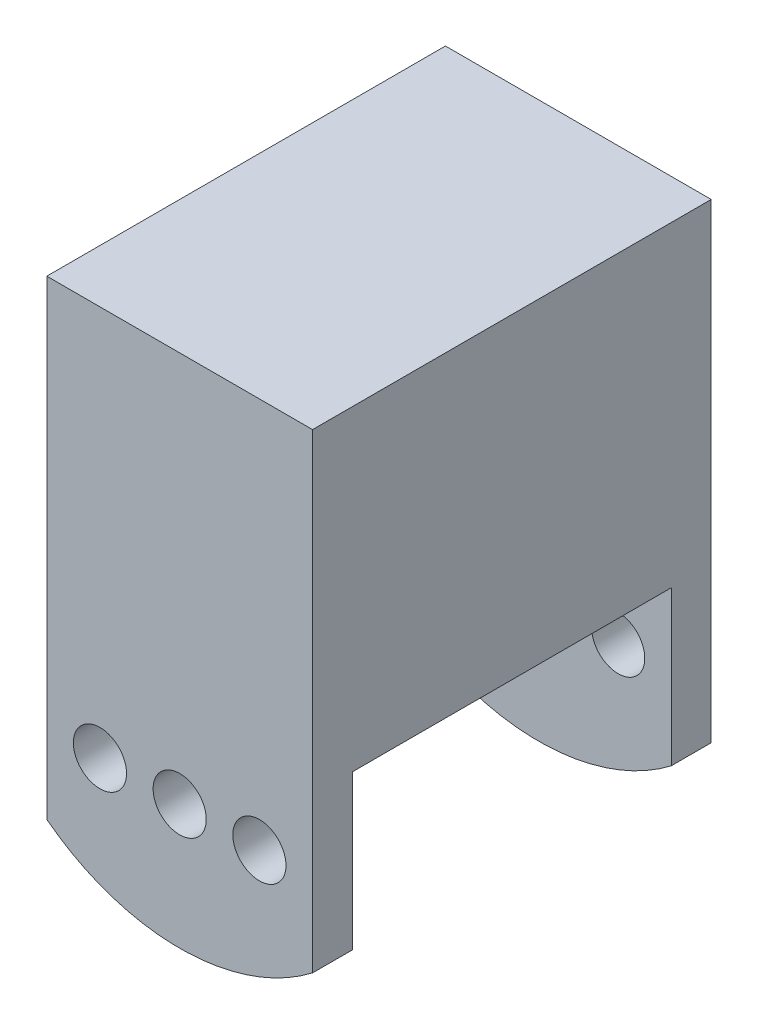
ISO-10303-21;
HEADER;
FILE_DESCRIPTION(('STEP AP214'),'2;1');
FILE_NAME('part.step','',(''),(''),'','','');
FILE_SCHEMA(('AUTOMOTIVE_DESIGN { 1 0 10303 214 1 1 1 1 }'));
ENDSEC;
DATA;
#1=APPLICATION_CONTEXT('core data for automotive mechanical design processes');
#2=APPLICATION_PROTOCOL_DEFINITION('international standard','automotive_design',2000,#1);
#3=PRODUCT_CONTEXT('',#1,'mechanical');
#4=PRODUCT('Part','Part','',(#3));
#5=PRODUCT_RELATED_PRODUCT_CATEGORY('part','',(#4));
#6=PRODUCT_DEFINITION_FORMATION('','',#4);
#7=PRODUCT_DEFINITION_CONTEXT('part definition',#1,'design');
#8=PRODUCT_DEFINITION('design','',#6,#7);
#9=PRODUCT_DEFINITION_SHAPE('','',#8);
#10=(LENGTH_UNIT() NAMED_UNIT(*) SI_UNIT(.MILLI.,.METRE.));
#11=(NAMED_UNIT(*) PLANE_ANGLE_UNIT() SI_UNIT($,.RADIAN.));
#12=(NAMED_UNIT(*) SI_UNIT($,.STERADIAN.) SOLID_ANGLE_UNIT());
#13=UNCERTAINTY_MEASURE_WITH_UNIT(LENGTH_MEASURE(1.E-05),#10,'distance_accuracy_value','');
#14=(GEOMETRIC_REPRESENTATION_CONTEXT(3) GLOBAL_UNCERTAINTY_ASSIGNED_CONTEXT((#13)) GLOBAL_UNIT_ASSIGNED_CONTEXT((#10,
#11,#12)) REPRESENTATION_CONTEXT('',''));
#15=CARTESIAN_POINT('',(0.,0.,0.));
#16=DIRECTION('',(0.,0.,1.));
#17=DIRECTION('',(1.,0.,0.));
#18=AXIS2_PLACEMENT_3D('',#15,#16,#17);
#19=CARTESIAN_POINT('',(0.,0.,30.));
#20=DIRECTION('',(0.,0.,-1.));
#21=DIRECTION('',(-1.,0.,0.));
#22=AXIS2_PLACEMENT_3D('',#19,#20,#21);
#23=CYLINDRICAL_SURFACE('',#22,16.4267963170458);
#24=DIRECTION('',(0.,0.,-1.));
#25=VECTOR('',#24,1.);
#26=CARTESIAN_POINT('',(10.,-13.032253728412,30.));
#27=LINE('',#26,#25);
#28=CARTESIAN_POINT('',(10.,-13.032253728412,3.));
#29=VERTEX_POINT('',#28);
#30=CARTESIAN_POINT('',(10.,-13.032253728412,0.));
#31=VERTEX_POINT('',#30);
#32=EDGE_CURVE('E83',#29,#31,#27,.T.);
#33=ORIENTED_EDGE('',*,*,#32,.F.);
#34=CARTESIAN_POINT('',(0.,0.,3.));
#35=DIRECTION('',(0.,0.,-1.));
#36=DIRECTION('',(-1.,0.,0.));
#37=AXIS2_PLACEMENT_3D('',#34,#35,#36);
#38=CIRCLE('',#37,16.4267963170458);
#39=CARTESIAN_POINT('',(-10.,-13.032253728412,3.));
#40=VERTEX_POINT('',#39);
#41=EDGE_CURVE('E54',#29,#40,#38,.T.);
#42=ORIENTED_EDGE('',*,*,#41,.T.);
#43=DIRECTION('',(0.,0.,-1.));
#44=VECTOR('',#43,1.);
#45=CARTESIAN_POINT('',(-10.,-13.032253728412,30.));
#46=LINE('',#45,#44);
#47=CARTESIAN_POINT('',(-10.,-13.032253728412,0.));
#48=VERTEX_POINT('',#47);
#49=EDGE_CURVE('E133',#40,#48,#46,.T.);
#50=ORIENTED_EDGE('',*,*,#49,.T.);
#51=CARTESIAN_POINT('',(0.,0.,0.));
#52=DIRECTION('',(0.,0.,1.));
#53=DIRECTION('',(1.,0.,0.));
#54=AXIS2_PLACEMENT_3D('',#51,#52,#53);
#55=CIRCLE('',#54,16.4267963170458);
#56=EDGE_CURVE('E184',#48,#31,#55,.T.);
#57=ORIENTED_EDGE('',*,*,#56,.T.);
#58=EDGE_LOOP('',(#33,#42,#50,#57));
#59=FACE_BOUND('',#58,.T.);
#60=ADVANCED_FACE('F37',(#59),#23,.T.);
#61=CARTESIAN_POINT('',(0.,-7.03225372841202,30.));
#62=DIRECTION('',(0.,0.,-1.));
#63=DIRECTION('',(-1.,0.,0.));
#64=AXIS2_PLACEMENT_3D('',#61,#62,#63);
#65=CYLINDRICAL_SURFACE('',#64,2.);
#66=CARTESIAN_POINT('',(0.,-7.03225372841202,27.));
#67=DIRECTION('',(0.,0.,1.));
#68=DIRECTION('',(1.,0.,0.));
#69=AXIS2_PLACEMENT_3D('',#66,#67,#68);
#70=CIRCLE('',#69,2.);
#71=CARTESIAN_POINT('',(2.,-7.03225372841202,27.));
#72=VERTEX_POINT('',#71);
#73=EDGE_CURVE('E158',#72,#72,#70,.T.);
#74=ORIENTED_EDGE('',*,*,#73,.F.);
#75=EDGE_LOOP('',(#74));
#76=FACE_BOUND('',#75,.T.);
#77=CARTESIAN_POINT('',(0.,-7.03225372841202,30.));
#78=DIRECTION('',(0.,0.,1.));
#79=DIRECTION('',(1.,0.,0.));
#80=AXIS2_PLACEMENT_3D('',#77,#78,#79);
#81=CIRCLE('',#80,2.);
#82=CARTESIAN_POINT('',(2.,-7.03225372841202,30.));
#83=VERTEX_POINT('',#82);
#84=EDGE_CURVE('E176',#83,#83,#81,.T.);
#85=ORIENTED_EDGE('',*,*,#84,.T.);
#86=EDGE_LOOP('',(#85));
#87=FACE_BOUND('',#86,.T.);
#88=ADVANCED_FACE('F231',(#76,#87),#65,.F.);
#89=CARTESIAN_POINT('',(6.,-7.03225372841202,30.));
#90=DIRECTION('',(0.,0.,-1.));
#91=DIRECTION('',(-1.,0.,0.));
#92=AXIS2_PLACEMENT_3D('',#89,#90,#91);
#93=CYLINDRICAL_SURFACE('',#92,2.);
#94=CARTESIAN_POINT('',(6.,-7.03225372841202,27.));
#95=DIRECTION('',(0.,0.,1.));
#96=DIRECTION('',(1.,0.,0.));
#97=AXIS2_PLACEMENT_3D('',#94,#95,#96);
#98=CIRCLE('',#97,2.);
#99=CARTESIAN_POINT('',(8.,-7.03225372841202,27.));
#100=VERTEX_POINT('',#99);
#101=EDGE_CURVE('E155',#100,#100,#98,.T.);
#102=ORIENTED_EDGE('',*,*,#101,.F.);
#103=EDGE_LOOP('',(#102));
#104=FACE_BOUND('',#103,.T.);
#105=CARTESIAN_POINT('',(6.,-7.03225372841202,30.));
#106=DIRECTION('',(0.,0.,1.));
#107=DIRECTION('',(1.,0.,0.));
#108=AXIS2_PLACEMENT_3D('',#105,#106,#107);
#109=CIRCLE('',#108,2.);
#110=CARTESIAN_POINT('',(8.,-7.03225372841202,30.));
#111=VERTEX_POINT('',#110);
#112=EDGE_CURVE('E170',#111,#111,#109,.T.);
#113=ORIENTED_EDGE('',*,*,#112,.T.);
#114=EDGE_LOOP('',(#113));
#115=FACE_BOUND('',#114,.T.);
#116=ADVANCED_FACE('F236',(#104,#115),#93,.F.);
#117=CARTESIAN_POINT('',(-6.,-7.03225372841202,30.));
#118=DIRECTION('',(0.,0.,-1.));
#119=DIRECTION('',(-1.,0.,0.));
#120=AXIS2_PLACEMENT_3D('',#117,#118,#119);
#121=CYLINDRICAL_SURFACE('',#120,2.);
#122=CARTESIAN_POINT('',(-6.,-7.03225372841202,27.));
#123=DIRECTION('',(0.,0.,1.));
#124=DIRECTION('',(1.,0.,0.));
#125=AXIS2_PLACEMENT_3D('',#122,#123,#124);
#126=CIRCLE('',#125,2.);
#127=CARTESIAN_POINT('',(-4.,-7.03225372841202,27.));
#128=VERTEX_POINT('',#127);
#129=EDGE_CURVE('E41',#128,#128,#126,.T.);
#130=ORIENTED_EDGE('',*,*,#129,.F.);
#131=EDGE_LOOP('',(#130));
#132=FACE_BOUND('',#131,.T.);
#133=CARTESIAN_POINT('',(-6.,-7.03225372841202,30.));
#134=DIRECTION('',(0.,0.,1.));
#135=DIRECTION('',(1.,0.,0.));
#136=AXIS2_PLACEMENT_3D('',#133,#134,#135);
#137=CIRCLE('',#136,2.);
#138=CARTESIAN_POINT('',(-4.,-7.03225372841202,30.));
#139=VERTEX_POINT('',#138);
#140=EDGE_CURVE('E164',#139,#139,#137,.T.);
#141=ORIENTED_EDGE('',*,*,#140,.T.);
#142=EDGE_LOOP('',(#141));
#143=FACE_BOUND('',#142,.T.);
#144=ADVANCED_FACE('F212',(#132,#143),#121,.F.);
#145=CARTESIAN_POINT('',(0.,0.,30.));
#146=DIRECTION('',(0.,0.,1.));
#147=DIRECTION('',(1.,0.,0.));
#148=AXIS2_PLACEMENT_3D('',#145,#146,#147);
#149=PLANE('',#148);
#150=ORIENTED_EDGE('',*,*,#112,.F.);
#151=EDGE_LOOP('',(#150));
#152=FACE_BOUND('',#151,.T.);
#153=DIRECTION('',(0.,1.,0.));
#154=VECTOR('',#153,1.);
#155=CARTESIAN_POINT('',(10.,22.377746271588,30.));
#156=LINE('',#155,#154);
#157=CARTESIAN_POINT('',(10.,-13.032253728412,30.));
#158=VERTEX_POINT('',#157);
#159=CARTESIAN_POINT('',(10.,22.377746271588,30.));
#160=VERTEX_POINT('',#159);
#161=EDGE_CURVE('E182',#158,#160,#156,.T.);
#162=ORIENTED_EDGE('',*,*,#161,.T.);
#163=DIRECTION('',(-1.,0.,0.));
#164=VECTOR('',#163,1.);
#165=CARTESIAN_POINT('',(-10.,22.377746271588,30.));
#166=LINE('',#165,#164);
#167=CARTESIAN_POINT('',(-10.,22.377746271588,30.));
#168=VERTEX_POINT('',#167);
#169=EDGE_CURVE('E90',#160,#168,#166,.T.);
#170=ORIENTED_EDGE('',*,*,#169,.T.);
#171=DIRECTION('',(0.,-1.,0.));
#172=VECTOR('',#171,1.);
#173=CARTESIAN_POINT('',(-10.,-13.032253728412,30.));
#174=LINE('',#173,#172);
#175=CARTESIAN_POINT('',(-10.,-13.032253728412,30.));
#176=VERTEX_POINT('',#175);
#177=EDGE_CURVE('E186',#168,#176,#174,.T.);
#178=ORIENTED_EDGE('',*,*,#177,.T.);
#179=CARTESIAN_POINT('',(0.,0.,30.));
#180=DIRECTION('',(0.,0.,1.));
#181=DIRECTION('',(1.,0.,0.));
#182=AXIS2_PLACEMENT_3D('',#179,#180,#181);
#183=CIRCLE('',#182,16.4267963170458);
#184=EDGE_CURVE('E63',#176,#158,#183,.T.);
#185=ORIENTED_EDGE('',*,*,#184,.T.);
#186=EDGE_LOOP('',(#162,#170,#178,#185));
#187=FACE_BOUND('',#186,.T.);
#188=ORIENTED_EDGE('',*,*,#84,.F.);
#189=EDGE_LOOP('',(#188));
#190=FACE_BOUND('',#189,.T.);
#191=ORIENTED_EDGE('',*,*,#140,.F.);
#192=EDGE_LOOP('',(#191));
#193=FACE_BOUND('',#192,.T.);
#194=ADVANCED_FACE('F217',(#152,#187,#190,#193),#149,.T.);
#195=CARTESIAN_POINT('',(0.,0.,0.));
#196=DIRECTION('',(0.,0.,1.));
#197=DIRECTION('',(1.,0.,0.));
#198=AXIS2_PLACEMENT_3D('',#195,#196,#197);
#199=PLANE('',#198);
#200=DIRECTION('',(0.,1.,0.));
#201=VECTOR('',#200,1.);
#202=CARTESIAN_POINT('',(10.,22.377746271588,0.));
#203=LINE('',#202,#201);
#204=CARTESIAN_POINT('',(10.,22.377746271588,0.));
#205=VERTEX_POINT('',#204);
#206=EDGE_CURVE('E179',#31,#205,#203,.T.);
#207=ORIENTED_EDGE('',*,*,#206,.F.);
#208=ORIENTED_EDGE('',*,*,#56,.F.);
#209=DIRECTION('',(0.,-1.,0.));
#210=VECTOR('',#209,1.);
#211=CARTESIAN_POINT('',(-10.,-13.032253728412,0.));
#212=LINE('',#211,#210);
#213=CARTESIAN_POINT('',(-10.,22.377746271588,0.));
#214=VERTEX_POINT('',#213);
#215=EDGE_CURVE('E192',#214,#48,#212,.T.);
#216=ORIENTED_EDGE('',*,*,#215,.F.);
#217=DIRECTION('',(-1.,0.,0.));
#218=VECTOR('',#217,1.);
#219=CARTESIAN_POINT('',(-10.,22.377746271588,0.));
#220=LINE('',#219,#218);
#221=EDGE_CURVE('E190',#205,#214,#220,.T.);
#222=ORIENTED_EDGE('',*,*,#221,.F.);
#223=EDGE_LOOP('',(#207,#208,#216,#222));
#224=FACE_BOUND('',#223,.T.);
#225=CARTESIAN_POINT('',(0.,-7.03225372841202,0.));
#226=DIRECTION('',(0.,0.,1.));
#227=DIRECTION('',(1.,0.,0.));
#228=AXIS2_PLACEMENT_3D('',#225,#226,#227);
#229=CIRCLE('',#228,2.);
#230=CARTESIAN_POINT('',(2.,-7.03225372841202,0.));
#231=VERTEX_POINT('',#230);
#232=EDGE_CURVE('E173',#231,#231,#229,.T.);
#233=ORIENTED_EDGE('',*,*,#232,.T.);
#234=EDGE_LOOP('',(#233));
#235=FACE_BOUND('',#234,.T.);
#236=CARTESIAN_POINT('',(6.,-7.03225372841202,0.));
#237=DIRECTION('',(0.,0.,1.));
#238=DIRECTION('',(1.,0.,0.));
#239=AXIS2_PLACEMENT_3D('',#236,#237,#238);
#240=CIRCLE('',#239,2.);
#241=CARTESIAN_POINT('',(8.,-7.03225372841202,0.));
#242=VERTEX_POINT('',#241);
#243=EDGE_CURVE('E167',#242,#242,#240,.T.);
#244=ORIENTED_EDGE('',*,*,#243,.T.);
#245=EDGE_LOOP('',(#244));
#246=FACE_BOUND('',#245,.T.);
#247=CARTESIAN_POINT('',(-6.,-7.03225372841202,0.));
#248=DIRECTION('',(0.,0.,1.));
#249=DIRECTION('',(1.,0.,0.));
#250=AXIS2_PLACEMENT_3D('',#247,#248,#249);
#251=CIRCLE('',#250,2.);
#252=CARTESIAN_POINT('',(-4.,-7.03225372841202,0.));
#253=VERTEX_POINT('',#252);
#254=EDGE_CURVE('E163',#253,#253,#251,.T.);
#255=ORIENTED_EDGE('',*,*,#254,.T.);
#256=EDGE_LOOP('',(#255));
#257=FACE_BOUND('',#256,.T.);
#258=ADVANCED_FACE('F215',(#224,#235,#246,#257),#199,.F.);
#259=CARTESIAN_POINT('',(10.,22.377746271588,30.));
#260=DIRECTION('',(-1.,0.,0.));
#261=DIRECTION('',(0.,0.,1.));
#262=AXIS2_PLACEMENT_3D('',#259,#260,#261);
#263=PLANE('',#262);
#264=CARTESIAN_POINT('',(10.,-13.032253728412,27.));
#265=VERTEX_POINT('',#264);
#266=EDGE_CURVE('E195',#158,#265,#27,.T.);
#267=ORIENTED_EDGE('',*,*,#266,.T.);
#268=DIRECTION('',(0.,-1.,0.));
#269=VECTOR('',#268,1.);
#270=CARTESIAN_POINT('',(10.,-16.4267963170458,27.));
#271=LINE('',#270,#269);
#272=CARTESIAN_POINT('',(10.,-1.42679631704578,27.));
#273=VERTEX_POINT('',#272);
#274=EDGE_CURVE('E140',#273,#265,#271,.T.);
#275=ORIENTED_EDGE('',*,*,#274,.F.);
#276=DIRECTION('',(0.,0.,1.));
#277=VECTOR('',#276,1.);
#278=CARTESIAN_POINT('',(10.,-1.42679631704578,27.));
#279=LINE('',#278,#277);
#280=CARTESIAN_POINT('',(10.,-1.42679631704578,3.));
#281=VERTEX_POINT('',#280);
#282=EDGE_CURVE('E136',#281,#273,#279,.T.);
#283=ORIENTED_EDGE('',*,*,#282,.F.);
#284=DIRECTION('',(0.,1.,0.));
#285=VECTOR('',#284,1.);
#286=CARTESIAN_POINT('',(10.,-16.4267963170458,3.));
#287=LINE('',#286,#285);
#288=EDGE_CURVE('E118',#29,#281,#287,.T.);
#289=ORIENTED_EDGE('',*,*,#288,.F.);
#290=ORIENTED_EDGE('',*,*,#32,.T.);
#291=ORIENTED_EDGE('',*,*,#206,.T.);
#292=DIRECTION('',(0.,0.,-1.));
#293=VECTOR('',#292,1.);
#294=CARTESIAN_POINT('',(10.,22.377746271588,30.));
#295=LINE('',#294,#293);
#296=EDGE_CURVE('E11',#160,#205,#295,.T.);
#297=ORIENTED_EDGE('',*,*,#296,.F.);
#298=ORIENTED_EDGE('',*,*,#161,.F.);
#299=EDGE_LOOP('',(#267,#275,#283,#289,#290,#291,#297,#298));
#300=FACE_BOUND('',#299,.T.);
#301=ADVANCED_FACE('F39',(#300),#263,.F.);
#302=CARTESIAN_POINT('',(-10.,22.377746271588,30.));
#303=DIRECTION('',(0.,-1.,0.));
#304=DIRECTION('',(0.,0.,-1.));
#305=AXIS2_PLACEMENT_3D('',#302,#303,#304);
#306=PLANE('',#305);
#307=ORIENTED_EDGE('',*,*,#221,.T.);
#308=DIRECTION('',(0.,0.,-1.));
#309=VECTOR('',#308,1.);
#310=CARTESIAN_POINT('',(-10.,22.377746271588,30.));
#311=LINE('',#310,#309);
#312=EDGE_CURVE('E46',#168,#214,#311,.T.);
#313=ORIENTED_EDGE('',*,*,#312,.F.);
#314=ORIENTED_EDGE('',*,*,#169,.F.);
#315=ORIENTED_EDGE('',*,*,#296,.T.);
#316=EDGE_LOOP('',(#307,#313,#314,#315));
#317=FACE_BOUND('',#316,.T.);
#318=ADVANCED_FACE('F224',(#317),#306,.F.);
#319=CARTESIAN_POINT('',(-10.,-13.032253728412,30.));
#320=DIRECTION('',(1.,0.,0.));
#321=DIRECTION('',(0.,0.,-1.));
#322=AXIS2_PLACEMENT_3D('',#319,#320,#321);
#323=PLANE('',#322);
#324=CARTESIAN_POINT('',(-10.,10.4732036829542,15.));
#325=DIRECTION('',(-1.,0.,0.));
#326=DIRECTION('',(0.,0.,1.));
#327=AXIS2_PLACEMENT_3D('',#324,#325,#326);
#328=CIRCLE('',#327,8.90000000000001);
#329=CARTESIAN_POINT('',(-10.,10.4732036829542,23.9));
#330=VERTEX_POINT('',#329);
#331=EDGE_CURVE('E552',#330,#330,#328,.T.);
#332=ORIENTED_EDGE('',*,*,#331,.F.);
#333=EDGE_LOOP('',(#332));
#334=FACE_BOUND('',#333,.T.);
#335=DIRECTION('',(0.,0.,1.));
#336=VECTOR('',#335,1.);
#337=CARTESIAN_POINT('',(-10.,-1.42679631704578,27.));
#338=LINE('',#337,#336);
#339=CARTESIAN_POINT('',(-10.,-1.42679631704578,3.));
#340=VERTEX_POINT('',#339);
#341=CARTESIAN_POINT('',(-10.,-1.42679631704578,27.));
#342=VERTEX_POINT('',#341);
#343=EDGE_CURVE('E123',#340,#342,#338,.T.);
#344=ORIENTED_EDGE('',*,*,#343,.T.);
#345=DIRECTION('',(0.,-1.,0.));
#346=VECTOR('',#345,1.);
#347=CARTESIAN_POINT('',(-10.,-16.4267963170458,27.));
#348=LINE('',#347,#346);
#349=CARTESIAN_POINT('',(-10.,-13.032253728412,27.));
#350=VERTEX_POINT('',#349);
#351=EDGE_CURVE('E134',#342,#350,#348,.T.);
#352=ORIENTED_EDGE('',*,*,#351,.T.);
#353=EDGE_CURVE('E198',#176,#350,#46,.T.);
#354=ORIENTED_EDGE('',*,*,#353,.F.);
#355=ORIENTED_EDGE('',*,*,#177,.F.);
#356=ORIENTED_EDGE('',*,*,#312,.T.);
#357=ORIENTED_EDGE('',*,*,#215,.T.);
#358=ORIENTED_EDGE('',*,*,#49,.F.);
#359=DIRECTION('',(0.,1.,0.));
#360=VECTOR('',#359,1.);
#361=CARTESIAN_POINT('',(-10.,-16.4267963170458,3.));
#362=LINE('',#361,#360);
#363=EDGE_CURVE('E116',#40,#340,#362,.T.);
#364=ORIENTED_EDGE('',*,*,#363,.T.);
#365=EDGE_LOOP('',(#344,#352,#354,#355,#356,#357,#358,#364));
#366=FACE_BOUND('',#365,.T.);
#367=ADVANCED_FACE('F131',(#334,#366),#323,.F.);
#368=ORIENTED_EDGE('',*,*,#353,.T.);
#369=CARTESIAN_POINT('',(0.,0.,27.));
#370=DIRECTION('',(0.,0.,1.));
#371=DIRECTION('',(1.,0.,0.));
#372=AXIS2_PLACEMENT_3D('',#369,#370,#371);
#373=CIRCLE('',#372,16.4267963170458);
#374=EDGE_CURVE('E161',#350,#265,#373,.T.);
#375=ORIENTED_EDGE('',*,*,#374,.T.);
#376=ORIENTED_EDGE('',*,*,#266,.F.);
#377=ORIENTED_EDGE('',*,*,#184,.F.);
#378=EDGE_LOOP('',(#368,#375,#376,#377));
#379=FACE_BOUND('',#378,.T.);
#380=ADVANCED_FACE('F232',(#379),#23,.T.);
#381=CARTESIAN_POINT('',(0.,-7.03225372841202,3.));
#382=DIRECTION('',(0.,0.,-1.));
#383=DIRECTION('',(-1.,0.,0.));
#384=AXIS2_PLACEMENT_3D('',#381,#382,#383);
#385=CIRCLE('',#384,2.);
#386=CARTESIAN_POINT('',(-2.,-7.03225372841202,3.));
#387=VERTEX_POINT('',#386);
#388=EDGE_CURVE('E151',#387,#387,#385,.T.);
#389=ORIENTED_EDGE('',*,*,#388,.F.);
#390=EDGE_LOOP('',(#389));
#391=FACE_BOUND('',#390,.T.);
#392=ORIENTED_EDGE('',*,*,#232,.F.);
#393=EDGE_LOOP('',(#392));
#394=FACE_BOUND('',#393,.T.);
#395=ADVANCED_FACE('F239',(#391,#394),#65,.F.);
#396=CARTESIAN_POINT('',(6.,-7.03225372841202,3.));
#397=DIRECTION('',(0.,0.,-1.));
#398=DIRECTION('',(-1.,0.,0.));
#399=AXIS2_PLACEMENT_3D('',#396,#397,#398);
#400=CIRCLE('',#399,2.);
#401=CARTESIAN_POINT('',(4.,-7.03225372841202,3.));
#402=VERTEX_POINT('',#401);
#403=EDGE_CURVE('E148',#402,#402,#400,.T.);
#404=ORIENTED_EDGE('',*,*,#403,.F.);
#405=EDGE_LOOP('',(#404));
#406=FACE_BOUND('',#405,.T.);
#407=ORIENTED_EDGE('',*,*,#243,.F.);
#408=EDGE_LOOP('',(#407));
#409=FACE_BOUND('',#408,.T.);
#410=ADVANCED_FACE('F210',(#406,#409),#93,.F.);
#411=CARTESIAN_POINT('',(-6.,-7.03225372841202,3.));
#412=DIRECTION('',(0.,0.,-1.));
#413=DIRECTION('',(-1.,0.,0.));
#414=AXIS2_PLACEMENT_3D('',#411,#412,#413);
#415=CIRCLE('',#414,2.);
#416=CARTESIAN_POINT('',(-8.,-7.03225372841202,3.));
#417=VERTEX_POINT('',#416);
#418=EDGE_CURVE('E146',#417,#417,#415,.T.);
#419=ORIENTED_EDGE('',*,*,#418,.F.);
#420=EDGE_LOOP('',(#419));
#421=FACE_BOUND('',#420,.T.);
#422=ORIENTED_EDGE('',*,*,#254,.F.);
#423=EDGE_LOOP('',(#422));
#424=FACE_BOUND('',#423,.T.);
#425=ADVANCED_FACE('F206',(#421,#424),#121,.F.);
#426=CARTESIAN_POINT('',(-10.,-16.4267963170458,27.));
#427=DIRECTION('',(0.,0.,1.));
#428=DIRECTION('',(1.,0.,0.));
#429=AXIS2_PLACEMENT_3D('',#426,#427,#428);
#430=PLANE('',#429);
#431=ORIENTED_EDGE('',*,*,#73,.T.);
#432=EDGE_LOOP('',(#431));
#433=FACE_BOUND('',#432,.T.);
#434=ORIENTED_EDGE('',*,*,#101,.T.);
#435=EDGE_LOOP('',(#434));
#436=FACE_BOUND('',#435,.T.);
#437=ORIENTED_EDGE('',*,*,#129,.T.);
#438=EDGE_LOOP('',(#437));
#439=FACE_BOUND('',#438,.T.);
#440=ORIENTED_EDGE('',*,*,#351,.F.);
#441=DIRECTION('',(1.,0.,0.));
#442=VECTOR('',#441,1.);
#443=CARTESIAN_POINT('',(-10.,-1.42679631704578,27.));
#444=LINE('',#443,#442);
#445=EDGE_CURVE('E122',#342,#273,#444,.T.);
#446=ORIENTED_EDGE('',*,*,#445,.T.);
#447=ORIENTED_EDGE('',*,*,#274,.T.);
#448=ORIENTED_EDGE('',*,*,#374,.F.);
#449=EDGE_LOOP('',(#440,#446,#447,#448));
#450=FACE_BOUND('',#449,.T.);
#451=ADVANCED_FACE('F209',(#433,#436,#439,#450),#430,.F.);
#452=CARTESIAN_POINT('',(-10.,-16.4267963170458,3.));
#453=DIRECTION('',(0.,0.,-1.));
#454=DIRECTION('',(-1.,0.,0.));
#455=AXIS2_PLACEMENT_3D('',#452,#453,#454);
#456=PLANE('',#455);
#457=ORIENTED_EDGE('',*,*,#388,.T.);
#458=EDGE_LOOP('',(#457));
#459=FACE_BOUND('',#458,.T.);
#460=ORIENTED_EDGE('',*,*,#403,.T.);
#461=EDGE_LOOP('',(#460));
#462=FACE_BOUND('',#461,.T.);
#463=ORIENTED_EDGE('',*,*,#418,.T.);
#464=EDGE_LOOP('',(#463));
#465=FACE_BOUND('',#464,.T.);
#466=ORIENTED_EDGE('',*,*,#288,.T.);
#467=DIRECTION('',(1.,0.,0.));
#468=VECTOR('',#467,1.);
#469=CARTESIAN_POINT('',(-10.,-1.42679631704578,3.));
#470=LINE('',#469,#468);
#471=EDGE_CURVE('E112',#340,#281,#470,.T.);
#472=ORIENTED_EDGE('',*,*,#471,.F.);
#473=ORIENTED_EDGE('',*,*,#363,.F.);
#474=ORIENTED_EDGE('',*,*,#41,.F.);
#475=EDGE_LOOP('',(#466,#472,#473,#474));
#476=FACE_BOUND('',#475,.T.);
#477=ADVANCED_FACE('F114',(#459,#462,#465,#476),#456,.F.);
#478=CARTESIAN_POINT('',(-10.,-1.42679631704578,27.));
#479=DIRECTION('',(0.,1.,0.));
#480=DIRECTION('',(0.,0.,1.));
#481=AXIS2_PLACEMENT_3D('',#478,#479,#480);
#482=PLANE('',#481);
#483=ORIENTED_EDGE('',*,*,#282,.T.);
#484=ORIENTED_EDGE('',*,*,#445,.F.);
#485=ORIENTED_EDGE('',*,*,#343,.F.);
#486=ORIENTED_EDGE('',*,*,#471,.T.);
#487=EDGE_LOOP('',(#483,#484,#485,#486));
#488=FACE_BOUND('',#487,.T.);
#489=ADVANCED_FACE('F126',(#488),#482,.F.);
#490=CARTESIAN_POINT('',(-7.,10.4732036829542,15.));
#491=DIRECTION('',(-1.,0.,0.));
#492=DIRECTION('',(0.,0.,1.));
#493=AXIS2_PLACEMENT_3D('',#490,#491,#492);
#494=CYLINDRICAL_SURFACE('',#493,8.90000000000001);
#495=CARTESIAN_POINT('',(-7.,10.4732036829542,15.));
#496=DIRECTION('',(-1.,0.,0.));
#497=DIRECTION('',(0.,0.,1.));
#498=AXIS2_PLACEMENT_3D('',#495,#496,#497);
#499=CIRCLE('',#498,8.90000000000001);
#500=CARTESIAN_POINT('',(-7.,10.4732036829542,23.9));
#501=VERTEX_POINT('',#500);
#502=EDGE_CURVE('E143',#501,#501,#499,.T.);
#503=ORIENTED_EDGE('',*,*,#502,.F.);
#504=EDGE_LOOP('',(#503));
#505=FACE_BOUND('',#504,.T.);
#506=ORIENTED_EDGE('',*,*,#331,.T.);
#507=EDGE_LOOP('',(#506));
#508=FACE_BOUND('',#507,.T.);
#509=ADVANCED_FACE('F281',(#505,#508),#494,.F.);
#510=CARTESIAN_POINT('',(-7.,10.4732036829542,15.));
#511=DIRECTION('',(-1.,0.,0.));
#512=DIRECTION('',(0.,0.,1.));
#513=AXIS2_PLACEMENT_3D('',#510,#511,#512);
#514=PLANE('',#513);
#515=CARTESIAN_POINT('',(-7.,10.4732036829542,21.));
#516=DIRECTION('',(-1.,0.,0.));
#517=DIRECTION('',(0.,0.,1.));
#518=AXIS2_PLACEMENT_3D('',#515,#516,#517);
#519=CIRCLE('',#518,2.);
#520=CARTESIAN_POINT('',(-7.,10.4732036829542,23.));
#521=VERTEX_POINT('',#520);
#522=EDGE_CURVE('E531',#521,#521,#519,.T.);
#523=ORIENTED_EDGE('',*,*,#522,.F.);
#524=EDGE_LOOP('',(#523));
#525=FACE_BOUND('',#524,.T.);
#526=CARTESIAN_POINT('',(-7.,10.4732036829542,9.));
#527=DIRECTION('',(-1.,0.,0.));
#528=DIRECTION('',(0.,0.,1.));
#529=AXIS2_PLACEMENT_3D('',#526,#527,#528);
#530=CIRCLE('',#529,2.);
#531=CARTESIAN_POINT('',(-7.,10.4732036829542,11.));
#532=VERTEX_POINT('',#531);
#533=EDGE_CURVE('E537',#532,#532,#530,.T.);
#534=ORIENTED_EDGE('',*,*,#533,.F.);
#535=EDGE_LOOP('',(#534));
#536=FACE_BOUND('',#535,.T.);
#537=CARTESIAN_POINT('',(-7.,4.47320368295422,15.));
#538=DIRECTION('',(-1.,0.,0.));
#539=DIRECTION('',(0.,0.,1.));
#540=AXIS2_PLACEMENT_3D('',#537,#538,#539);
#541=CIRCLE('',#540,2.);
#542=CARTESIAN_POINT('',(-7.,4.47320368295422,17.));
#543=VERTEX_POINT('',#542);
#544=EDGE_CURVE('E543',#543,#543,#541,.T.);
#545=ORIENTED_EDGE('',*,*,#544,.F.);
#546=EDGE_LOOP('',(#545));
#547=FACE_BOUND('',#546,.T.);
#548=CARTESIAN_POINT('',(-7.,16.4732036829542,15.));
#549=DIRECTION('',(-1.,0.,0.));
#550=DIRECTION('',(0.,0.,1.));
#551=AXIS2_PLACEMENT_3D('',#548,#549,#550);
#552=CIRCLE('',#551,2.);
#553=CARTESIAN_POINT('',(-7.,16.4732036829542,17.));
#554=VERTEX_POINT('',#553);
#555=EDGE_CURVE('E549',#554,#554,#552,.T.);
#556=ORIENTED_EDGE('',*,*,#555,.F.);
#557=EDGE_LOOP('',(#556));
#558=FACE_BOUND('',#557,.T.);
#559=ORIENTED_EDGE('',*,*,#502,.T.);
#560=EDGE_LOOP('',(#559));
#561=FACE_BOUND('',#560,.T.);
#562=ADVANCED_FACE('F286',(#525,#536,#547,#558,#561),#514,.T.);
#563=CARTESIAN_POINT('',(-7.,16.4732036829542,15.));
#564=DIRECTION('',(-1.,0.,0.));
#565=DIRECTION('',(0.,0.,1.));
#566=AXIS2_PLACEMENT_3D('',#563,#564,#565);
#567=CYLINDRICAL_SURFACE('',#566,2.);
#568=ORIENTED_EDGE('',*,*,#555,.T.);
#569=EDGE_LOOP('',(#568));
#570=FACE_BOUND('',#569,.T.);
#571=CARTESIAN_POINT('',(-10.,16.4732036829542,15.));
#572=DIRECTION('',(-1.,0.,0.));
#573=DIRECTION('',(0.,0.,1.));
#574=AXIS2_PLACEMENT_3D('',#571,#572,#573);
#575=CIRCLE('',#574,2.);
#576=CARTESIAN_POINT('',(-10.,16.4732036829542,17.));
#577=VERTEX_POINT('',#576);
#578=EDGE_CURVE('E546',#577,#577,#575,.T.);
#579=ORIENTED_EDGE('',*,*,#578,.F.);
#580=EDGE_LOOP('',(#579));
#581=FACE_BOUND('',#580,.T.);
#582=ADVANCED_FACE('F298',(#570,#581),#567,.T.);
#583=CARTESIAN_POINT('',(-7.,4.47320368295422,15.));
#584=DIRECTION('',(-1.,0.,0.));
#585=DIRECTION('',(0.,0.,1.));
#586=AXIS2_PLACEMENT_3D('',#583,#584,#585);
#587=CYLINDRICAL_SURFACE('',#586,2.);
#588=ORIENTED_EDGE('',*,*,#544,.T.);
#589=EDGE_LOOP('',(#588));
#590=FACE_BOUND('',#589,.T.);
#591=CARTESIAN_POINT('',(-10.,4.47320368295422,15.));
#592=DIRECTION('',(-1.,0.,0.));
#593=DIRECTION('',(0.,0.,1.));
#594=AXIS2_PLACEMENT_3D('',#591,#592,#593);
#595=CIRCLE('',#594,2.);
#596=CARTESIAN_POINT('',(-10.,4.47320368295422,17.));
#597=VERTEX_POINT('',#596);
#598=EDGE_CURVE('E540',#597,#597,#595,.T.);
#599=ORIENTED_EDGE('',*,*,#598,.F.);
#600=EDGE_LOOP('',(#599));
#601=FACE_BOUND('',#600,.T.);
#602=ADVANCED_FACE('F309',(#590,#601),#587,.T.);
#603=CARTESIAN_POINT('',(-7.,10.4732036829542,9.));
#604=DIRECTION('',(-1.,0.,0.));
#605=DIRECTION('',(0.,0.,1.));
#606=AXIS2_PLACEMENT_3D('',#603,#604,#605);
#607=CYLINDRICAL_SURFACE('',#606,2.);
#608=ORIENTED_EDGE('',*,*,#533,.T.);
#609=EDGE_LOOP('',(#608));
#610=FACE_BOUND('',#609,.T.);
#611=CARTESIAN_POINT('',(-10.,10.4732036829542,9.));
#612=DIRECTION('',(-1.,0.,0.));
#613=DIRECTION('',(0.,0.,1.));
#614=AXIS2_PLACEMENT_3D('',#611,#612,#613);
#615=CIRCLE('',#614,2.);
#616=CARTESIAN_POINT('',(-10.,10.4732036829542,11.));
#617=VERTEX_POINT('',#616);
#618=EDGE_CURVE('E534',#617,#617,#615,.T.);
#619=ORIENTED_EDGE('',*,*,#618,.F.);
#620=EDGE_LOOP('',(#619));
#621=FACE_BOUND('',#620,.T.);
#622=ADVANCED_FACE('F320',(#610,#621),#607,.T.);
#623=CARTESIAN_POINT('',(-7.,10.4732036829542,21.));
#624=DIRECTION('',(-1.,0.,0.));
#625=DIRECTION('',(0.,0.,1.));
#626=AXIS2_PLACEMENT_3D('',#623,#624,#625);
#627=CYLINDRICAL_SURFACE('',#626,2.);
#628=ORIENTED_EDGE('',*,*,#522,.T.);
#629=EDGE_LOOP('',(#628));
#630=FACE_BOUND('',#629,.T.);
#631=CARTESIAN_POINT('',(-10.,10.4732036829542,21.));
#632=DIRECTION('',(-1.,0.,0.));
#633=DIRECTION('',(0.,0.,1.));
#634=AXIS2_PLACEMENT_3D('',#631,#632,#633);
#635=CIRCLE('',#634,2.);
#636=CARTESIAN_POINT('',(-10.,10.4732036829542,23.));
#637=VERTEX_POINT('',#636);
#638=EDGE_CURVE('E529',#637,#637,#635,.T.);
#639=ORIENTED_EDGE('',*,*,#638,.F.);
#640=EDGE_LOOP('',(#639));
#641=FACE_BOUND('',#640,.T.);
#642=ADVANCED_FACE('F331',(#630,#641),#627,.T.);
#643=ORIENTED_EDGE('',*,*,#618,.T.);
#644=EDGE_LOOP('',(#643));
#645=FACE_BOUND('',#644,.T.);
#646=ADVANCED_FACE('F342',(#645),#323,.F.);
#647=ORIENTED_EDGE('',*,*,#598,.T.);
#648=EDGE_LOOP('',(#647));
#649=FACE_BOUND('',#648,.T.);
#650=ADVANCED_FACE('F353',(#649),#323,.F.);
#651=ORIENTED_EDGE('',*,*,#578,.T.);
#652=EDGE_LOOP('',(#651));
#653=FACE_BOUND('',#652,.T.);
#654=ADVANCED_FACE('F249',(#653),#323,.F.);
#655=ORIENTED_EDGE('',*,*,#638,.T.);
#656=EDGE_LOOP('',(#655));
#657=FACE_BOUND('',#656,.T.);
#658=ADVANCED_FACE('F250',(#657),#323,.F.);
#659=CLOSED_SHELL('',(#60,#88,#116,#144,#194,#258,#301,#318,#367,#380,#395,#410,#425,#451,#477,
#489,#509,#562,#582,#602,#622,#642,#646,#650,#654,#658));
#660=MANIFOLD_SOLID_BREP('B2',#659);
#661=ADVANCED_BREP_SHAPE_REPRESENTATION('',(#18,#660),#14);
#662=SHAPE_DEFINITION_REPRESENTATION(#9,#661);
ENDSEC;
END-ISO-10303-21;
